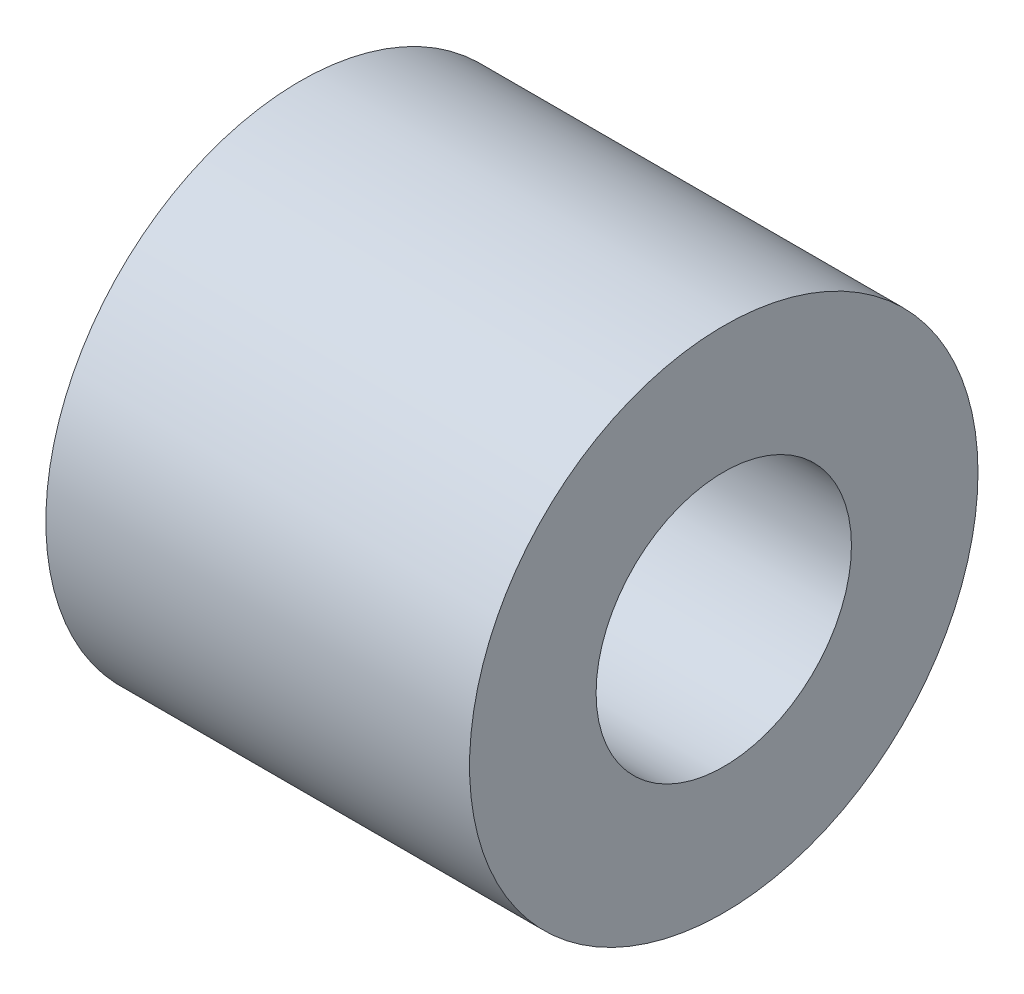
ISO-10303-21;
HEADER;
FILE_DESCRIPTION(('STEP AP214'),'2;1');
FILE_NAME('part.step','',(''),(''),'','','');
FILE_SCHEMA(('AUTOMOTIVE_DESIGN { 1 0 10303 214 1 1 1 1 }'));
ENDSEC;
DATA;
#1=APPLICATION_CONTEXT('core data for automotive mechanical design processes');
#2=APPLICATION_PROTOCOL_DEFINITION('international standard','automotive_design',2000,#1);
#3=PRODUCT_CONTEXT('',#1,'mechanical');
#4=PRODUCT('Part','Part','',(#3));
#5=PRODUCT_RELATED_PRODUCT_CATEGORY('part','',(#4));
#6=PRODUCT_DEFINITION_FORMATION('','',#4);
#7=PRODUCT_DEFINITION_CONTEXT('part definition',#1,'design');
#8=PRODUCT_DEFINITION('design','',#6,#7);
#9=PRODUCT_DEFINITION_SHAPE('','',#8);
#10=(LENGTH_UNIT() NAMED_UNIT(*) SI_UNIT(.MILLI.,.METRE.));
#11=(NAMED_UNIT(*) PLANE_ANGLE_UNIT() SI_UNIT($,.RADIAN.));
#12=(NAMED_UNIT(*) SI_UNIT($,.STERADIAN.) SOLID_ANGLE_UNIT());
#13=UNCERTAINTY_MEASURE_WITH_UNIT(LENGTH_MEASURE(1.E-05),#10,'distance_accuracy_value','');
#14=(GEOMETRIC_REPRESENTATION_CONTEXT(3) GLOBAL_UNCERTAINTY_ASSIGNED_CONTEXT((#13)) GLOBAL_UNIT_ASSIGNED_CONTEXT((#10,
#11,#12)) REPRESENTATION_CONTEXT('',''));
#15=CARTESIAN_POINT('',(0.,0.,0.));
#16=DIRECTION('',(0.,0.,1.));
#17=DIRECTION('',(1.,0.,0.));
#18=AXIS2_PLACEMENT_3D('',#15,#16,#17);
#19=CARTESIAN_POINT('',(10.,0.,0.));
#20=DIRECTION('',(-1.,0.,0.));
#21=DIRECTION('',(0.,0.,1.));
#22=AXIS2_PLACEMENT_3D('',#19,#20,#21);
#23=CYLINDRICAL_SURFACE('',#22,6.);
#24=CARTESIAN_POINT('',(10.,0.,0.));
#25=DIRECTION('',(1.,0.,0.));
#26=DIRECTION('',(0.,0.,-1.));
#27=AXIS2_PLACEMENT_3D('',#24,#25,#26);
#28=CIRCLE('',#27,6.);
#29=CARTESIAN_POINT('',(10.,0.,-6.));
#30=VERTEX_POINT('',#29);
#31=EDGE_CURVE('E10',#30,#30,#28,.T.);
#32=ORIENTED_EDGE('',*,*,#31,.F.);
#33=EDGE_LOOP('',(#32));
#34=FACE_BOUND('',#33,.T.);
#35=CARTESIAN_POINT('',(0.,0.,0.));
#36=DIRECTION('',(1.,0.,0.));
#37=DIRECTION('',(0.,0.,-1.));
#38=AXIS2_PLACEMENT_3D('',#35,#36,#37);
#39=CIRCLE('',#38,6.);
#40=CARTESIAN_POINT('',(0.,0.,-6.));
#41=VERTEX_POINT('',#40);
#42=EDGE_CURVE('E37',#41,#41,#39,.T.);
#43=ORIENTED_EDGE('',*,*,#42,.T.);
#44=EDGE_LOOP('',(#43));
#45=FACE_BOUND('',#44,.T.);
#46=ADVANCED_FACE('F34',(#34,#45),#23,.T.);
#47=CARTESIAN_POINT('',(10.,0.,0.));
#48=DIRECTION('',(1.,0.,0.));
#49=DIRECTION('',(0.,0.,-1.));
#50=AXIS2_PLACEMENT_3D('',#47,#48,#49);
#51=PLANE('',#50);
#52=CARTESIAN_POINT('',(10.,0.,0.));
#53=DIRECTION('',(-1.,0.,0.));
#54=DIRECTION('',(0.,0.,1.));
#55=AXIS2_PLACEMENT_3D('',#52,#53,#54);
#56=CIRCLE('',#55,3.01324045758294);
#57=CARTESIAN_POINT('',(10.,0.,3.01324045758294));
#58=VERTEX_POINT('',#57);
#59=EDGE_CURVE('E44',#58,#58,#56,.T.);
#60=ORIENTED_EDGE('',*,*,#59,.T.);
#61=EDGE_LOOP('',(#60));
#62=FACE_BOUND('',#61,.T.);
#63=ORIENTED_EDGE('',*,*,#31,.T.);
#64=EDGE_LOOP('',(#63));
#65=FACE_BOUND('',#64,.T.);
#66=ADVANCED_FACE('F52',(#62,#65),#51,.T.);
#67=CARTESIAN_POINT('',(0.,0.,0.));
#68=DIRECTION('',(1.,0.,0.));
#69=DIRECTION('',(0.,0.,-1.));
#70=AXIS2_PLACEMENT_3D('',#67,#68,#69);
#71=PLANE('',#70);
#72=CARTESIAN_POINT('',(0.,0.,0.));
#73=DIRECTION('',(-1.,0.,0.));
#74=DIRECTION('',(0.,0.,1.));
#75=AXIS2_PLACEMENT_3D('',#72,#73,#74);
#76=CIRCLE('',#75,3.01324045758294);
#77=CARTESIAN_POINT('',(0.,0.,3.01324045758294));
#78=VERTEX_POINT('',#77);
#79=EDGE_CURVE('E46',#78,#78,#76,.T.);
#80=ORIENTED_EDGE('',*,*,#79,.F.);
#81=EDGE_LOOP('',(#80));
#82=FACE_BOUND('',#81,.T.);
#83=ORIENTED_EDGE('',*,*,#42,.F.);
#84=EDGE_LOOP('',(#83));
#85=FACE_BOUND('',#84,.T.);
#86=ADVANCED_FACE('F57',(#82,#85),#71,.F.);
#87=CARTESIAN_POINT('',(10.,0.,0.));
#88=DIRECTION('',(-1.,0.,0.));
#89=DIRECTION('',(0.,0.,1.));
#90=AXIS2_PLACEMENT_3D('',#87,#88,#89);
#91=CYLINDRICAL_SURFACE('',#90,3.01324045758294);
#92=ORIENTED_EDGE('',*,*,#59,.F.);
#93=EDGE_LOOP('',(#92));
#94=FACE_BOUND('',#93,.T.);
#95=ORIENTED_EDGE('',*,*,#79,.T.);
#96=EDGE_LOOP('',(#95));
#97=FACE_BOUND('',#96,.T.);
#98=ADVANCED_FACE('F54',(#94,#97),#91,.F.);
#99=CLOSED_SHELL('',(#46,#66,#86,#98));
#100=MANIFOLD_SOLID_BREP('B2',#99);
#101=ADVANCED_BREP_SHAPE_REPRESENTATION('',(#18,#100),#14);
#102=SHAPE_DEFINITION_REPRESENTATION(#9,#101);
ENDSEC;
END-ISO-10303-21;
